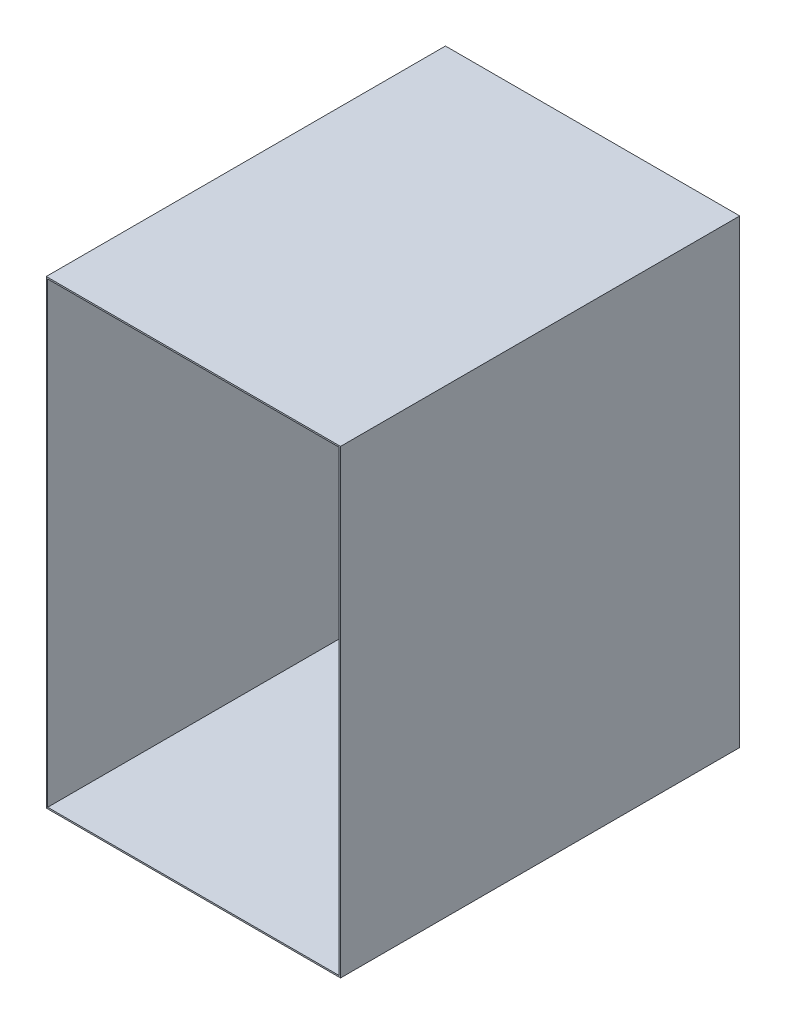
ISO-10303-21;
HEADER;
FILE_DESCRIPTION(('STEP AP214'),'2;1');
FILE_NAME('part.step','',(''),(''),'','','');
FILE_SCHEMA(('AUTOMOTIVE_DESIGN { 1 0 10303 214 1 1 1 1 }'));
ENDSEC;
DATA;
#1=APPLICATION_CONTEXT('core data for automotive mechanical design processes');
#2=APPLICATION_PROTOCOL_DEFINITION('international standard','automotive_design',2000,#1);
#3=PRODUCT_CONTEXT('',#1,'mechanical');
#4=PRODUCT('Part','Part','',(#3));
#5=PRODUCT_RELATED_PRODUCT_CATEGORY('part','',(#4));
#6=PRODUCT_DEFINITION_FORMATION('','',#4);
#7=PRODUCT_DEFINITION_CONTEXT('part definition',#1,'design');
#8=PRODUCT_DEFINITION('design','',#6,#7);
#9=PRODUCT_DEFINITION_SHAPE('','',#8);
#10=(LENGTH_UNIT() NAMED_UNIT(*) SI_UNIT(.MILLI.,.METRE.));
#11=(NAMED_UNIT(*) PLANE_ANGLE_UNIT() SI_UNIT($,.RADIAN.));
#12=(NAMED_UNIT(*) SI_UNIT($,.STERADIAN.) SOLID_ANGLE_UNIT());
#13=UNCERTAINTY_MEASURE_WITH_UNIT(LENGTH_MEASURE(1.E-05),#10,'distance_accuracy_value','');
#14=(GEOMETRIC_REPRESENTATION_CONTEXT(3) GLOBAL_UNCERTAINTY_ASSIGNED_CONTEXT((#13)) GLOBAL_UNIT_ASSIGNED_CONTEXT((#10,
#11,#12)) REPRESENTATION_CONTEXT('',''));
#15=CARTESIAN_POINT('',(0.,0.,0.));
#16=DIRECTION('',(0.,0.,1.));
#17=DIRECTION('',(1.,0.,0.));
#18=AXIS2_PLACEMENT_3D('',#15,#16,#17);
#19=CARTESIAN_POINT('',(0.,0.,0.));
#20=DIRECTION('',(0.,0.,-1.));
#21=DIRECTION('',(-1.,0.,0.));
#22=AXIS2_PLACEMENT_3D('',#19,#20,#21);
#23=PLANE('',#22);
#24=DIRECTION('',(0.,-1.,0.));
#25=VECTOR('',#24,1.);
#26=CARTESIAN_POINT('',(0.,0.,0.));
#27=LINE('',#26,#25);
#28=CARTESIAN_POINT('',(0.,250.825,0.));
#29=VERTEX_POINT('',#28);
#30=CARTESIAN_POINT('',(0.,0.,0.));
#31=VERTEX_POINT('',#30);
#32=EDGE_CURVE('E120',#29,#31,#27,.T.);
#33=ORIENTED_EDGE('',*,*,#32,.T.);
#34=DIRECTION('',(1.,0.,0.));
#35=VECTOR('',#34,1.);
#36=CARTESIAN_POINT('',(0.,0.,0.));
#37=LINE('',#36,#35);
#38=CARTESIAN_POINT('',(160.3375,0.,0.));
#39=VERTEX_POINT('',#38);
#40=EDGE_CURVE('E163',#31,#39,#37,.T.);
#41=ORIENTED_EDGE('',*,*,#40,.T.);
#42=DIRECTION('',(0.,1.,0.));
#43=VECTOR('',#42,1.);
#44=CARTESIAN_POINT('',(160.3375,0.,0.));
#45=LINE('',#44,#43);
#46=CARTESIAN_POINT('',(160.3375,250.825,0.));
#47=VERTEX_POINT('',#46);
#48=EDGE_CURVE('E166',#39,#47,#45,.T.);
#49=ORIENTED_EDGE('',*,*,#48,.T.);
#50=DIRECTION('',(-1.,0.,0.));
#51=VECTOR('',#50,1.);
#52=CARTESIAN_POINT('',(0.,250.825,0.));
#53=LINE('',#52,#51);
#54=EDGE_CURVE('E154',#47,#29,#53,.T.);
#55=ORIENTED_EDGE('',*,*,#54,.T.);
#56=EDGE_LOOP('',(#33,#41,#49,#55));
#57=FACE_BOUND('',#56,.T.);
#58=DIRECTION('',(0.,-1.,0.));
#59=VECTOR('',#58,1.);
#60=CARTESIAN_POINT('',(0.79375,0.,0.));
#61=LINE('',#60,#59);
#62=CARTESIAN_POINT('',(0.79375,250.03125,0.));
#63=VERTEX_POINT('',#62);
#64=CARTESIAN_POINT('',(0.79375,0.79375,0.));
#65=VERTEX_POINT('',#64);
#66=EDGE_CURVE('E144',#63,#65,#61,.T.);
#67=ORIENTED_EDGE('',*,*,#66,.F.);
#68=DIRECTION('',(-1.,0.,0.));
#69=VECTOR('',#68,1.);
#70=CARTESIAN_POINT('',(0.,250.03125,0.));
#71=LINE('',#70,#69);
#72=CARTESIAN_POINT('',(159.54375,250.03125,0.));
#73=VERTEX_POINT('',#72);
#74=EDGE_CURVE('E116',#73,#63,#71,.T.);
#75=ORIENTED_EDGE('',*,*,#74,.F.);
#76=DIRECTION('',(0.,1.,0.));
#77=VECTOR('',#76,1.);
#78=CARTESIAN_POINT('',(159.54375,0.,0.));
#79=LINE('',#78,#77);
#80=CARTESIAN_POINT('',(159.54375,0.79375,0.));
#81=VERTEX_POINT('',#80);
#82=EDGE_CURVE('E53',#81,#73,#79,.T.);
#83=ORIENTED_EDGE('',*,*,#82,.F.);
#84=DIRECTION('',(1.,0.,0.));
#85=VECTOR('',#84,1.);
#86=CARTESIAN_POINT('',(0.,0.79375,0.));
#87=LINE('',#86,#85);
#88=EDGE_CURVE('E146',#65,#81,#87,.T.);
#89=ORIENTED_EDGE('',*,*,#88,.F.);
#90=EDGE_LOOP('',(#67,#75,#83,#89));
#91=FACE_BOUND('',#90,.T.);
#92=ADVANCED_FACE('F36',(#57,#91),#23,.F.);
#93=CARTESIAN_POINT('',(0.,0.,-217.4875));
#94=DIRECTION('',(-1.,0.,0.));
#95=DIRECTION('',(0.,0.,1.));
#96=AXIS2_PLACEMENT_3D('',#93,#94,#95);
#97=PLANE('',#96);
#98=ORIENTED_EDGE('',*,*,#32,.F.);
#99=DIRECTION('',(0.,0.,1.));
#100=VECTOR('',#99,1.);
#101=CARTESIAN_POINT('',(0.,250.825,-217.4875));
#102=LINE('',#101,#100);
#103=CARTESIAN_POINT('',(0.,250.825,-217.4875));
#104=VERTEX_POINT('',#103);
#105=EDGE_CURVE('E11',#104,#29,#102,.T.);
#106=ORIENTED_EDGE('',*,*,#105,.F.);
#107=DIRECTION('',(0.,-1.,0.));
#108=VECTOR('',#107,1.);
#109=CARTESIAN_POINT('',(0.,0.,-217.4875));
#110=LINE('',#109,#108);
#111=CARTESIAN_POINT('',(0.,0.,-217.4875));
#112=VERTEX_POINT('',#111);
#113=EDGE_CURVE('E151',#104,#112,#110,.T.);
#114=ORIENTED_EDGE('',*,*,#113,.T.);
#115=DIRECTION('',(0.,0.,1.));
#116=VECTOR('',#115,1.);
#117=CARTESIAN_POINT('',(0.,0.,-217.4875));
#118=LINE('',#117,#116);
#119=EDGE_CURVE('E86',#112,#31,#118,.T.);
#120=ORIENTED_EDGE('',*,*,#119,.T.);
#121=EDGE_LOOP('',(#98,#106,#114,#120));
#122=FACE_BOUND('',#121,.T.);
#123=ADVANCED_FACE('F38',(#122),#97,.T.);
#124=CARTESIAN_POINT('',(0.,250.825,-217.4875));
#125=DIRECTION('',(0.,1.,0.));
#126=DIRECTION('',(0.,0.,1.));
#127=AXIS2_PLACEMENT_3D('',#124,#125,#126);
#128=PLANE('',#127);
#129=ORIENTED_EDGE('',*,*,#54,.F.);
#130=DIRECTION('',(0.,0.,1.));
#131=VECTOR('',#130,1.);
#132=CARTESIAN_POINT('',(160.3375,250.825,-217.4875));
#133=LINE('',#132,#131);
#134=CARTESIAN_POINT('',(160.3375,250.825,-217.4875));
#135=VERTEX_POINT('',#134);
#136=EDGE_CURVE('E45',#135,#47,#133,.T.);
#137=ORIENTED_EDGE('',*,*,#136,.F.);
#138=DIRECTION('',(-1.,0.,0.));
#139=VECTOR('',#138,1.);
#140=CARTESIAN_POINT('',(0.,250.825,-217.4875));
#141=LINE('',#140,#139);
#142=EDGE_CURVE('E159',#135,#104,#141,.T.);
#143=ORIENTED_EDGE('',*,*,#142,.T.);
#144=ORIENTED_EDGE('',*,*,#105,.T.);
#145=EDGE_LOOP('',(#129,#137,#143,#144));
#146=FACE_BOUND('',#145,.T.);
#147=ADVANCED_FACE('F200',(#146),#128,.T.);
#148=CARTESIAN_POINT('',(160.3375,0.,-217.4875));
#149=DIRECTION('',(1.,0.,0.));
#150=DIRECTION('',(0.,0.,-1.));
#151=AXIS2_PLACEMENT_3D('',#148,#149,#150);
#152=PLANE('',#151);
#153=ORIENTED_EDGE('',*,*,#48,.F.);
#154=DIRECTION('',(0.,0.,1.));
#155=VECTOR('',#154,1.);
#156=CARTESIAN_POINT('',(160.3375,0.,-217.4875));
#157=LINE('',#156,#155);
#158=CARTESIAN_POINT('',(160.3375,0.,-217.4875));
#159=VERTEX_POINT('',#158);
#160=EDGE_CURVE('E172',#159,#39,#157,.T.);
#161=ORIENTED_EDGE('',*,*,#160,.F.);
#162=DIRECTION('',(0.,1.,0.));
#163=VECTOR('',#162,1.);
#164=CARTESIAN_POINT('',(160.3375,0.,-217.4875));
#165=LINE('',#164,#163);
#166=EDGE_CURVE('E156',#159,#135,#165,.T.);
#167=ORIENTED_EDGE('',*,*,#166,.T.);
#168=ORIENTED_EDGE('',*,*,#136,.T.);
#169=EDGE_LOOP('',(#153,#161,#167,#168));
#170=FACE_BOUND('',#169,.T.);
#171=ADVANCED_FACE('F203',(#170),#152,.T.);
#172=CARTESIAN_POINT('',(0.,0.,-217.4875));
#173=DIRECTION('',(0.,-1.,0.));
#174=DIRECTION('',(0.,0.,-1.));
#175=AXIS2_PLACEMENT_3D('',#172,#173,#174);
#176=PLANE('',#175);
#177=ORIENTED_EDGE('',*,*,#40,.F.);
#178=ORIENTED_EDGE('',*,*,#119,.F.);
#179=DIRECTION('',(1.,0.,0.));
#180=VECTOR('',#179,1.);
#181=CARTESIAN_POINT('',(0.,0.,-217.4875));
#182=LINE('',#181,#180);
#183=EDGE_CURVE('E153',#112,#159,#182,.T.);
#184=ORIENTED_EDGE('',*,*,#183,.T.);
#185=ORIENTED_EDGE('',*,*,#160,.T.);
#186=EDGE_LOOP('',(#177,#178,#184,#185));
#187=FACE_BOUND('',#186,.T.);
#188=ADVANCED_FACE('F195',(#187),#176,.T.);
#189=CARTESIAN_POINT('',(0.,0.,-217.4875));
#190=DIRECTION('',(0.,0.,-1.));
#191=DIRECTION('',(-1.,0.,0.));
#192=AXIS2_PLACEMENT_3D('',#189,#190,#191);
#193=PLANE('',#192);
#194=CARTESIAN_POINT('',(102.39375,125.4125,-217.4875));
#195=DIRECTION('',(0.,0.,-1.));
#196=DIRECTION('',(-1.,0.,0.));
#197=AXIS2_PLACEMENT_3D('',#194,#195,#196);
#198=CIRCLE('',#197,1.65100000000001);
#199=CARTESIAN_POINT('',(100.74275,125.4125,-217.4875));
#200=VERTEX_POINT('',#199);
#201=EDGE_CURVE('E176',#200,#200,#198,.T.);
#202=ORIENTED_EDGE('',*,*,#201,.F.);
#203=EDGE_LOOP('',(#202));
#204=FACE_BOUND('',#203,.T.);
#205=CARTESIAN_POINT('',(57.94375,125.4125,-217.4875));
#206=DIRECTION('',(0.,0.,-1.));
#207=DIRECTION('',(-1.,0.,0.));
#208=AXIS2_PLACEMENT_3D('',#205,#206,#207);
#209=CIRCLE('',#208,1.65100000000001);
#210=CARTESIAN_POINT('',(56.29275,125.4125,-217.4875));
#211=VERTEX_POINT('',#210);
#212=EDGE_CURVE('E181',#211,#211,#209,.T.);
#213=ORIENTED_EDGE('',*,*,#212,.F.);
#214=EDGE_LOOP('',(#213));
#215=FACE_BOUND('',#214,.T.);
#216=ORIENTED_EDGE('',*,*,#113,.F.);
#217=ORIENTED_EDGE('',*,*,#142,.F.);
#218=ORIENTED_EDGE('',*,*,#166,.F.);
#219=ORIENTED_EDGE('',*,*,#183,.F.);
#220=EDGE_LOOP('',(#216,#217,#218,#219));
#221=FACE_BOUND('',#220,.T.);
#222=ADVANCED_FACE('F192',(#204,#215,#221),#193,.T.);
#223=CARTESIAN_POINT('',(0.79375,0.,-217.4875));
#224=DIRECTION('',(-1.,0.,0.));
#225=DIRECTION('',(0.,0.,1.));
#226=AXIS2_PLACEMENT_3D('',#223,#224,#225);
#227=PLANE('',#226);
#228=ORIENTED_EDGE('',*,*,#66,.T.);
#229=DIRECTION('',(0.,0.,1.));
#230=VECTOR('',#229,1.);
#231=CARTESIAN_POINT('',(0.79375,0.79375,-217.4875));
#232=LINE('',#231,#230);
#233=CARTESIAN_POINT('',(0.79375,0.79375,-216.69375));
#234=VERTEX_POINT('',#233);
#235=EDGE_CURVE('E126',#234,#65,#232,.T.);
#236=ORIENTED_EDGE('',*,*,#235,.F.);
#237=DIRECTION('',(0.,-1.,0.));
#238=VECTOR('',#237,1.);
#239=CARTESIAN_POINT('',(0.79375,0.,-216.69375));
#240=LINE('',#239,#238);
#241=CARTESIAN_POINT('',(0.79375,250.03125,-216.69375));
#242=VERTEX_POINT('',#241);
#243=EDGE_CURVE('E124',#242,#234,#240,.T.);
#244=ORIENTED_EDGE('',*,*,#243,.F.);
#245=DIRECTION('',(0.,0.,1.));
#246=VECTOR('',#245,1.);
#247=CARTESIAN_POINT('',(0.79375,250.03125,-217.4875));
#248=LINE('',#247,#246);
#249=EDGE_CURVE('E110',#242,#63,#248,.T.);
#250=ORIENTED_EDGE('',*,*,#249,.T.);
#251=EDGE_LOOP('',(#228,#236,#244,#250));
#252=FACE_BOUND('',#251,.T.);
#253=ADVANCED_FACE('F125',(#252),#227,.F.);
#254=CARTESIAN_POINT('',(0.,250.03125,-217.4875));
#255=DIRECTION('',(0.,1.,0.));
#256=DIRECTION('',(0.,0.,1.));
#257=AXIS2_PLACEMENT_3D('',#254,#255,#256);
#258=PLANE('',#257);
#259=ORIENTED_EDGE('',*,*,#74,.T.);
#260=ORIENTED_EDGE('',*,*,#249,.F.);
#261=DIRECTION('',(-1.,0.,0.));
#262=VECTOR('',#261,1.);
#263=CARTESIAN_POINT('',(0.,250.03125,-216.69375));
#264=LINE('',#263,#262);
#265=CARTESIAN_POINT('',(159.54375,250.03125,-216.69375));
#266=VERTEX_POINT('',#265);
#267=EDGE_CURVE('E114',#266,#242,#264,.T.);
#268=ORIENTED_EDGE('',*,*,#267,.F.);
#269=DIRECTION('',(0.,0.,1.));
#270=VECTOR('',#269,1.);
#271=CARTESIAN_POINT('',(159.54375,250.03125,-217.4875));
#272=LINE('',#271,#270);
#273=EDGE_CURVE('E121',#266,#73,#272,.T.);
#274=ORIENTED_EDGE('',*,*,#273,.T.);
#275=EDGE_LOOP('',(#259,#260,#268,#274));
#276=FACE_BOUND('',#275,.T.);
#277=ADVANCED_FACE('F112',(#276),#258,.F.);
#278=CARTESIAN_POINT('',(159.54375,0.,-217.4875));
#279=DIRECTION('',(1.,0.,0.));
#280=DIRECTION('',(0.,0.,-1.));
#281=AXIS2_PLACEMENT_3D('',#278,#279,#280);
#282=PLANE('',#281);
#283=ORIENTED_EDGE('',*,*,#82,.T.);
#284=ORIENTED_EDGE('',*,*,#273,.F.);
#285=DIRECTION('',(0.,1.,0.));
#286=VECTOR('',#285,1.);
#287=CARTESIAN_POINT('',(159.54375,0.,-216.69375));
#288=LINE('',#287,#286);
#289=CARTESIAN_POINT('',(159.54375,0.79375,-216.69375));
#290=VERTEX_POINT('',#289);
#291=EDGE_CURVE('E135',#290,#266,#288,.T.);
#292=ORIENTED_EDGE('',*,*,#291,.F.);
#293=DIRECTION('',(0.,0.,1.));
#294=VECTOR('',#293,1.);
#295=CARTESIAN_POINT('',(159.54375,0.79375,-217.4875));
#296=LINE('',#295,#294);
#297=EDGE_CURVE('E137',#290,#81,#296,.T.);
#298=ORIENTED_EDGE('',*,*,#297,.T.);
#299=EDGE_LOOP('',(#283,#284,#292,#298));
#300=FACE_BOUND('',#299,.T.);
#301=ADVANCED_FACE('F245',(#300),#282,.F.);
#302=CARTESIAN_POINT('',(0.,0.79375,-217.4875));
#303=DIRECTION('',(0.,-1.,0.));
#304=DIRECTION('',(0.,0.,-1.));
#305=AXIS2_PLACEMENT_3D('',#302,#303,#304);
#306=PLANE('',#305);
#307=ORIENTED_EDGE('',*,*,#88,.T.);
#308=ORIENTED_EDGE('',*,*,#297,.F.);
#309=DIRECTION('',(1.,0.,0.));
#310=VECTOR('',#309,1.);
#311=CARTESIAN_POINT('',(0.,0.79375,-216.69375));
#312=LINE('',#311,#310);
#313=EDGE_CURVE('E130',#234,#290,#312,.T.);
#314=ORIENTED_EDGE('',*,*,#313,.F.);
#315=ORIENTED_EDGE('',*,*,#235,.T.);
#316=EDGE_LOOP('',(#307,#308,#314,#315));
#317=FACE_BOUND('',#316,.T.);
#318=ADVANCED_FACE('F253',(#317),#306,.F.);
#319=CARTESIAN_POINT('',(0.,0.,-216.69375));
#320=DIRECTION('',(0.,0.,-1.));
#321=DIRECTION('',(-1.,0.,0.));
#322=AXIS2_PLACEMENT_3D('',#319,#320,#321);
#323=PLANE('',#322);
#324=CARTESIAN_POINT('',(102.39375,125.4125,-216.69375));
#325=DIRECTION('',(0.,0.,-1.));
#326=DIRECTION('',(-1.,0.,0.));
#327=AXIS2_PLACEMENT_3D('',#324,#325,#326);
#328=CIRCLE('',#327,1.65100000000001);
#329=CARTESIAN_POINT('',(100.74275,125.4125,-216.69375));
#330=VERTEX_POINT('',#329);
#331=EDGE_CURVE('E40',#330,#330,#328,.T.);
#332=ORIENTED_EDGE('',*,*,#331,.T.);
#333=EDGE_LOOP('',(#332));
#334=FACE_BOUND('',#333,.T.);
#335=CARTESIAN_POINT('',(57.94375,125.4125,-216.69375));
#336=DIRECTION('',(0.,0.,-1.));
#337=DIRECTION('',(-1.,0.,0.));
#338=AXIS2_PLACEMENT_3D('',#335,#336,#337);
#339=CIRCLE('',#338,1.65100000000001);
#340=CARTESIAN_POINT('',(56.29275,125.4125,-216.69375));
#341=VERTEX_POINT('',#340);
#342=EDGE_CURVE('E174',#341,#341,#339,.T.);
#343=ORIENTED_EDGE('',*,*,#342,.T.);
#344=EDGE_LOOP('',(#343));
#345=FACE_BOUND('',#344,.T.);
#346=ORIENTED_EDGE('',*,*,#243,.T.);
#347=ORIENTED_EDGE('',*,*,#313,.T.);
#348=ORIENTED_EDGE('',*,*,#291,.T.);
#349=ORIENTED_EDGE('',*,*,#267,.T.);
#350=EDGE_LOOP('',(#346,#347,#348,#349));
#351=FACE_BOUND('',#350,.T.);
#352=ADVANCED_FACE('F133',(#334,#345,#351),#323,.F.);
#353=CARTESIAN_POINT('',(57.94375,125.4125,0.));
#354=DIRECTION('',(0.,0.,-1.));
#355=DIRECTION('',(-1.,0.,0.));
#356=AXIS2_PLACEMENT_3D('',#353,#354,#355);
#357=CYLINDRICAL_SURFACE('',#356,1.65100000000001);
#358=ORIENTED_EDGE('',*,*,#212,.T.);
#359=EDGE_LOOP('',(#358));
#360=FACE_BOUND('',#359,.T.);
#361=ORIENTED_EDGE('',*,*,#342,.F.);
#362=EDGE_LOOP('',(#361));
#363=FACE_BOUND('',#362,.T.);
#364=ADVANCED_FACE('F189',(#360,#363),#357,.F.);
#365=CARTESIAN_POINT('',(102.39375,125.4125,0.));
#366=DIRECTION('',(0.,0.,-1.));
#367=DIRECTION('',(-1.,0.,0.));
#368=AXIS2_PLACEMENT_3D('',#365,#366,#367);
#369=CYLINDRICAL_SURFACE('',#368,1.65100000000001);
#370=ORIENTED_EDGE('',*,*,#201,.T.);
#371=EDGE_LOOP('',(#370));
#372=FACE_BOUND('',#371,.T.);
#373=ORIENTED_EDGE('',*,*,#331,.F.);
#374=EDGE_LOOP('',(#373));
#375=FACE_BOUND('',#374,.T.);
#376=ADVANCED_FACE('F276',(#372,#375),#369,.F.);
#377=CLOSED_SHELL('',(#92,#123,#147,#171,#188,#222,#253,#277,#301,#318,#352,#364,#376));
#378=MANIFOLD_SOLID_BREP('B2',#377);
#379=ADVANCED_BREP_SHAPE_REPRESENTATION('',(#18,#378),#14);
#380=SHAPE_DEFINITION_REPRESENTATION(#9,#379);
ENDSEC;
END-ISO-10303-21;
